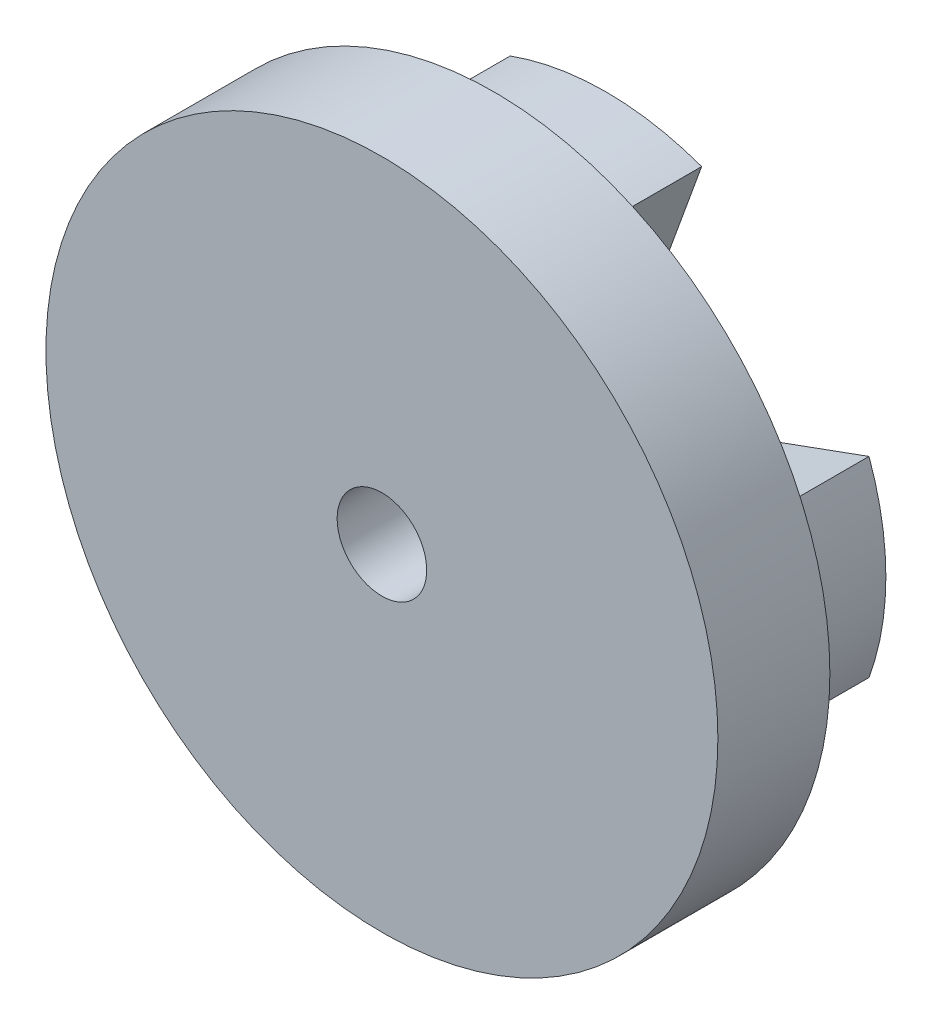
ISO-10303-21;
HEADER;
FILE_DESCRIPTION(('STEP AP214'),'2;1');
FILE_NAME('part.step','',(''),(''),'','','');
FILE_SCHEMA(('AUTOMOTIVE_DESIGN { 1 0 10303 214 1 1 1 1 }'));
ENDSEC;
DATA;
#1=APPLICATION_CONTEXT('core data for automotive mechanical design processes');
#2=APPLICATION_PROTOCOL_DEFINITION('international standard','automotive_design',2000,#1);
#3=PRODUCT_CONTEXT('',#1,'mechanical');
#4=PRODUCT('Part','Part','',(#3));
#5=PRODUCT_RELATED_PRODUCT_CATEGORY('part','',(#4));
#6=PRODUCT_DEFINITION_FORMATION('','',#4);
#7=PRODUCT_DEFINITION_CONTEXT('part definition',#1,'design');
#8=PRODUCT_DEFINITION('design','',#6,#7);
#9=PRODUCT_DEFINITION_SHAPE('','',#8);
#10=(LENGTH_UNIT() NAMED_UNIT(*) SI_UNIT(.MILLI.,.METRE.));
#11=(NAMED_UNIT(*) PLANE_ANGLE_UNIT() SI_UNIT($,.RADIAN.));
#12=(NAMED_UNIT(*) SI_UNIT($,.STERADIAN.) SOLID_ANGLE_UNIT());
#13=UNCERTAINTY_MEASURE_WITH_UNIT(LENGTH_MEASURE(1.E-05),#10,'distance_accuracy_value','');
#14=(GEOMETRIC_REPRESENTATION_CONTEXT(3) GLOBAL_UNCERTAINTY_ASSIGNED_CONTEXT((#13)) GLOBAL_UNIT_ASSIGNED_CONTEXT((#10,
#11,#12)) REPRESENTATION_CONTEXT('',''));
#15=CARTESIAN_POINT('',(0.,0.,0.));
#16=DIRECTION('',(0.,0.,1.));
#17=DIRECTION('',(1.,0.,0.));
#18=AXIS2_PLACEMENT_3D('',#15,#16,#17);
#19=CARTESIAN_POINT('',(0.,0.,0.));
#20=DIRECTION('',(0.,0.,1.));
#21=DIRECTION('',(1.,0.,0.));
#22=AXIS2_PLACEMENT_3D('',#19,#20,#21);
#23=PLANE('',#22);
#24=CARTESIAN_POINT('',(0.,0.,0.));
#25=DIRECTION('',(0.,0.,-1.));
#26=DIRECTION('',(-1.,0.,0.));
#27=AXIS2_PLACEMENT_3D('',#24,#25,#26);
#28=CIRCLE('',#27,2.);
#29=CARTESIAN_POINT('',(-2.,0.,0.));
#30=VERTEX_POINT('',#29);
#31=EDGE_CURVE('E350',#30,#30,#28,.T.);
#32=ORIENTED_EDGE('',*,*,#31,.F.);
#33=EDGE_LOOP('',(#32));
#34=FACE_BOUND('',#33,.T.);
#35=CARTESIAN_POINT('',(0.,0.,0.));
#36=DIRECTION('',(0.,0.,-1.));
#37=DIRECTION('',(-1.,0.,0.));
#38=AXIS2_PLACEMENT_3D('',#35,#36,#37);
#39=CIRCLE('',#38,12.5);
#40=CARTESIAN_POINT('',(4.27525179157087,-11.7461577598239,0.));
#41=VERTEX_POINT('',#40);
#42=CARTESIAN_POINT('',(-4.27525179157087,-11.7461577598239,0.));
#43=VERTEX_POINT('',#42);
#44=EDGE_CURVE('E177',#41,#43,#39,.T.);
#45=ORIENTED_EDGE('',*,*,#44,.F.);
#46=DIRECTION('',(0.34202014332567,-0.939692620785908,0.));
#47=VECTOR('',#46,1.);
#48=CARTESIAN_POINT('',(2.56515107494252,-7.04769465589431,0.));
#49=LINE('',#48,#47);
#50=CARTESIAN_POINT('',(2.56515107494253,-7.04769465589431,0.));
#51=VERTEX_POINT('',#50);
#52=EDGE_CURVE('E193',#51,#41,#49,.T.);
#53=ORIENTED_EDGE('',*,*,#52,.F.);
#54=CARTESIAN_POINT('',(0.,0.,0.));
#55=DIRECTION('',(0.,0.,1.));
#56=DIRECTION('',(-1.,0.,0.));
#57=AXIS2_PLACEMENT_3D('',#54,#55,#56);
#58=CIRCLE('',#57,7.5);
#59=CARTESIAN_POINT('',(-2.56515107494252,-7.04769465589431,0.));
#60=VERTEX_POINT('',#59);
#61=EDGE_CURVE('E206',#60,#51,#58,.T.);
#62=ORIENTED_EDGE('',*,*,#61,.F.);
#63=DIRECTION('',(0.34202014332567,0.939692620785908,0.));
#64=VECTOR('',#63,1.);
#65=CARTESIAN_POINT('',(-2.56515107494252,-7.04769465589431,0.));
#66=LINE('',#65,#64);
#67=EDGE_CURVE('E182',#43,#60,#66,.T.);
#68=ORIENTED_EDGE('',*,*,#67,.F.);
#69=EDGE_LOOP('',(#45,#53,#62,#68));
#70=FACE_BOUND('',#69,.T.);
#71=CARTESIAN_POINT('',(0.,0.,0.));
#72=DIRECTION('',(0.,0.,-1.));
#73=DIRECTION('',(-1.,0.,0.));
#74=AXIS2_PLACEMENT_3D('',#71,#72,#73);
#75=CIRCLE('',#74,12.5);
#76=CARTESIAN_POINT('',(-4.27525179157087,11.7461577598239,0.));
#77=VERTEX_POINT('',#76);
#78=CARTESIAN_POINT('',(4.27525179157087,11.7461577598239,0.));
#79=VERTEX_POINT('',#78);
#80=EDGE_CURVE('E273',#77,#79,#75,.T.);
#81=ORIENTED_EDGE('',*,*,#80,.F.);
#82=DIRECTION('',(-0.34202014332567,0.939692620785908,0.));
#83=VECTOR('',#82,1.);
#84=CARTESIAN_POINT('',(-2.56515107494252,7.04769465589431,0.));
#85=LINE('',#84,#83);
#86=CARTESIAN_POINT('',(-2.56515107494252,7.04769465589431,0.));
#87=VERTEX_POINT('',#86);
#88=EDGE_CURVE('E279',#87,#77,#85,.T.);
#89=ORIENTED_EDGE('',*,*,#88,.F.);
#90=CARTESIAN_POINT('',(0.,0.,0.));
#91=DIRECTION('',(0.,0.,1.));
#92=DIRECTION('',(-1.,0.,0.));
#93=AXIS2_PLACEMENT_3D('',#90,#91,#92);
#94=CIRCLE('',#93,7.5);
#95=CARTESIAN_POINT('',(2.56515107494252,7.04769465589431,0.));
#96=VERTEX_POINT('',#95);
#97=EDGE_CURVE('E296',#96,#87,#94,.T.);
#98=ORIENTED_EDGE('',*,*,#97,.F.);
#99=DIRECTION('',(-0.34202014332567,-0.939692620785908,0.));
#100=VECTOR('',#99,1.);
#101=CARTESIAN_POINT('',(2.56515107494252,7.04769465589431,0.));
#102=LINE('',#101,#100);
#103=EDGE_CURVE('E292',#79,#96,#102,.T.);
#104=ORIENTED_EDGE('',*,*,#103,.F.);
#105=EDGE_LOOP('',(#81,#89,#98,#104));
#106=FACE_BOUND('',#105,.T.);
#107=CARTESIAN_POINT('',(0.,0.,0.));
#108=DIRECTION('',(0.,0.,1.));
#109=DIRECTION('',(1.,0.,0.));
#110=AXIS2_PLACEMENT_3D('',#107,#108,#109);
#111=CIRCLE('',#110,15.);
#112=CARTESIAN_POINT('',(15.,0.,0.));
#113=VERTEX_POINT('',#112);
#114=EDGE_CURVE('E43',#113,#113,#111,.T.);
#115=ORIENTED_EDGE('',*,*,#114,.F.);
#116=EDGE_LOOP('',(#115));
#117=FACE_BOUND('',#116,.T.);
#118=CARTESIAN_POINT('',(0.,0.,0.));
#119=DIRECTION('',(0.,0.,-1.));
#120=DIRECTION('',(-1.,0.,0.));
#121=AXIS2_PLACEMENT_3D('',#118,#119,#120);
#122=CIRCLE('',#121,12.5);
#123=CARTESIAN_POINT('',(-11.7461577598239,-4.27525179157087,0.));
#124=VERTEX_POINT('',#123);
#125=CARTESIAN_POINT('',(-11.7461577598239,4.27525179157087,0.));
#126=VERTEX_POINT('',#125);
#127=EDGE_CURVE('E228',#124,#126,#122,.T.);
#128=ORIENTED_EDGE('',*,*,#127,.F.);
#129=DIRECTION('',(-0.939692620785908,-0.342020143325669,0.));
#130=VECTOR('',#129,1.);
#131=CARTESIAN_POINT('',(-7.04769465589431,-2.56515107494252,0.));
#132=LINE('',#131,#130);
#133=CARTESIAN_POINT('',(-7.04769465589431,-2.56515107494252,0.));
#134=VERTEX_POINT('',#133);
#135=EDGE_CURVE('E234',#134,#124,#132,.T.);
#136=ORIENTED_EDGE('',*,*,#135,.F.);
#137=CARTESIAN_POINT('',(0.,0.,0.));
#138=DIRECTION('',(0.,0.,1.));
#139=DIRECTION('',(-1.,0.,0.));
#140=AXIS2_PLACEMENT_3D('',#137,#138,#139);
#141=CIRCLE('',#140,7.5);
#142=CARTESIAN_POINT('',(-7.04769465589431,2.56515107494252,0.));
#143=VERTEX_POINT('',#142);
#144=EDGE_CURVE('E251',#143,#134,#141,.T.);
#145=ORIENTED_EDGE('',*,*,#144,.F.);
#146=DIRECTION('',(0.939692620785908,-0.34202014332567,0.));
#147=VECTOR('',#146,1.);
#148=CARTESIAN_POINT('',(-7.04769465589431,2.56515107494252,0.));
#149=LINE('',#148,#147);
#150=EDGE_CURVE('E247',#126,#143,#149,.T.);
#151=ORIENTED_EDGE('',*,*,#150,.F.);
#152=EDGE_LOOP('',(#128,#136,#145,#151));
#153=FACE_BOUND('',#152,.T.);
#154=CARTESIAN_POINT('',(0.,0.,0.));
#155=DIRECTION('',(0.,0.,-1.));
#156=DIRECTION('',(-1.,0.,0.));
#157=AXIS2_PLACEMENT_3D('',#154,#155,#156);
#158=CIRCLE('',#157,12.5);
#159=CARTESIAN_POINT('',(11.7461577598239,4.27525179157087,0.));
#160=VERTEX_POINT('',#159);
#161=CARTESIAN_POINT('',(11.7461577598239,-4.27525179157087,0.));
#162=VERTEX_POINT('',#161);
#163=EDGE_CURVE('E175',#160,#162,#158,.T.);
#164=ORIENTED_EDGE('',*,*,#163,.F.);
#165=DIRECTION('',(0.939692620785908,0.342020143325669,0.));
#166=VECTOR('',#165,1.);
#167=CARTESIAN_POINT('',(7.04769465589431,2.56515107494252,0.));
#168=LINE('',#167,#166);
#169=CARTESIAN_POINT('',(7.04769465589431,2.56515107494252,0.));
#170=VERTEX_POINT('',#169);
#171=EDGE_CURVE('E172',#170,#160,#168,.T.);
#172=ORIENTED_EDGE('',*,*,#171,.F.);
#173=CARTESIAN_POINT('',(0.,0.,0.));
#174=DIRECTION('',(0.,0.,1.));
#175=DIRECTION('',(-1.,0.,0.));
#176=AXIS2_PLACEMENT_3D('',#173,#174,#175);
#177=CIRCLE('',#176,7.5);
#178=CARTESIAN_POINT('',(7.04769465589431,-2.56515107494252,0.));
#179=VERTEX_POINT('',#178);
#180=EDGE_CURVE('E60',#179,#170,#177,.T.);
#181=ORIENTED_EDGE('',*,*,#180,.F.);
#182=DIRECTION('',(-0.939692620785908,0.34202014332567,0.));
#183=VECTOR('',#182,1.);
#184=CARTESIAN_POINT('',(7.04769465589431,-2.56515107494252,0.));
#185=LINE('',#184,#183);
#186=EDGE_CURVE('E55',#162,#179,#185,.T.);
#187=ORIENTED_EDGE('',*,*,#186,.F.);
#188=EDGE_LOOP('',(#164,#172,#181,#187));
#189=FACE_BOUND('',#188,.T.);
#190=ADVANCED_FACE('F39',(#34,#70,#106,#117,#153,#189),#23,.F.);
#191=CARTESIAN_POINT('',(0.,0.,5.));
#192=DIRECTION('',(0.,0.,-1.));
#193=DIRECTION('',(-1.,0.,0.));
#194=AXIS2_PLACEMENT_3D('',#191,#192,#193);
#195=CYLINDRICAL_SURFACE('',#194,15.);
#196=CARTESIAN_POINT('',(0.,0.,5.));
#197=DIRECTION('',(0.,0.,1.));
#198=DIRECTION('',(1.,0.,0.));
#199=AXIS2_PLACEMENT_3D('',#196,#197,#198);
#200=CIRCLE('',#199,15.);
#201=CARTESIAN_POINT('',(15.,0.,5.));
#202=VERTEX_POINT('',#201);
#203=EDGE_CURVE('E11',#202,#202,#200,.T.);
#204=ORIENTED_EDGE('',*,*,#203,.F.);
#205=EDGE_LOOP('',(#204));
#206=FACE_BOUND('',#205,.T.);
#207=ORIENTED_EDGE('',*,*,#114,.T.);
#208=EDGE_LOOP('',(#207));
#209=FACE_BOUND('',#208,.T.);
#210=ADVANCED_FACE('F41',(#206,#209),#195,.T.);
#211=CARTESIAN_POINT('',(0.,0.,5.));
#212=DIRECTION('',(0.,0.,1.));
#213=DIRECTION('',(1.,0.,0.));
#214=AXIS2_PLACEMENT_3D('',#211,#212,#213);
#215=PLANE('',#214);
#216=CARTESIAN_POINT('',(0.,0.,5.));
#217=DIRECTION('',(0.,0.,-1.));
#218=DIRECTION('',(-1.,0.,0.));
#219=AXIS2_PLACEMENT_3D('',#216,#217,#218);
#220=CIRCLE('',#219,2.);
#221=CARTESIAN_POINT('',(-2.,0.,5.));
#222=VERTEX_POINT('',#221);
#223=EDGE_CURVE('E329',#222,#222,#220,.T.);
#224=ORIENTED_EDGE('',*,*,#223,.T.);
#225=EDGE_LOOP('',(#224));
#226=FACE_BOUND('',#225,.T.);
#227=ORIENTED_EDGE('',*,*,#203,.T.);
#228=EDGE_LOOP('',(#227));
#229=FACE_BOUND('',#228,.T.);
#230=ADVANCED_FACE('F358',(#226,#229),#215,.T.);
#231=CARTESIAN_POINT('',(0.,0.,-5.));
#232=DIRECTION('',(0.,0.,1.));
#233=DIRECTION('',(1.,0.,0.));
#234=AXIS2_PLACEMENT_3D('',#231,#232,#233);
#235=CYLINDRICAL_SURFACE('',#234,12.5);
#236=ORIENTED_EDGE('',*,*,#80,.T.);
#237=DIRECTION('',(0.,0.,1.));
#238=VECTOR('',#237,1.);
#239=CARTESIAN_POINT('',(4.27525179157087,11.7461577598239,-5.));
#240=LINE('',#239,#238);
#241=CARTESIAN_POINT('',(4.27525179157087,11.7461577598239,-5.));
#242=VERTEX_POINT('',#241);
#243=EDGE_CURVE('E314',#242,#79,#240,.T.);
#244=ORIENTED_EDGE('',*,*,#243,.F.);
#245=CARTESIAN_POINT('',(0.,0.,-5.));
#246=DIRECTION('',(0.,0.,-1.));
#247=DIRECTION('',(-1.,0.,0.));
#248=AXIS2_PLACEMENT_3D('',#245,#246,#247);
#249=CIRCLE('',#248,12.5);
#250=CARTESIAN_POINT('',(-4.27525179157087,11.7461577598239,-5.));
#251=VERTEX_POINT('',#250);
#252=EDGE_CURVE('E274',#251,#242,#249,.T.);
#253=ORIENTED_EDGE('',*,*,#252,.F.);
#254=DIRECTION('',(0.,0.,1.));
#255=VECTOR('',#254,1.);
#256=CARTESIAN_POINT('',(-4.27525179157087,11.7461577598239,-5.));
#257=LINE('',#256,#255);
#258=EDGE_CURVE('E288',#251,#77,#257,.T.);
#259=ORIENTED_EDGE('',*,*,#258,.T.);
#260=EDGE_LOOP('',(#236,#244,#253,#259));
#261=FACE_BOUND('',#260,.T.);
#262=ADVANCED_FACE('F375',(#261),#235,.T.);
#263=CARTESIAN_POINT('',(2.56515107494252,7.04769465589431,-5.));
#264=DIRECTION('',(-0.939692620785908,0.34202014332567,0.));
#265=DIRECTION('',(-0.34202014332567,-0.939692620785908,0.));
#266=AXIS2_PLACEMENT_3D('',#263,#264,#265);
#267=PLANE('',#266);
#268=ORIENTED_EDGE('',*,*,#103,.T.);
#269=DIRECTION('',(0.,0.,1.));
#270=VECTOR('',#269,1.);
#271=CARTESIAN_POINT('',(2.56515107494252,7.04769465589431,-5.));
#272=LINE('',#271,#270);
#273=CARTESIAN_POINT('',(2.56515107494252,7.04769465589431,-5.));
#274=VERTEX_POINT('',#273);
#275=EDGE_CURVE('E310',#274,#96,#272,.T.);
#276=ORIENTED_EDGE('',*,*,#275,.F.);
#277=DIRECTION('',(-0.34202014332567,-0.939692620785908,0.));
#278=VECTOR('',#277,1.);
#279=CARTESIAN_POINT('',(2.56515107494252,7.04769465589431,-5.));
#280=LINE('',#279,#278);
#281=EDGE_CURVE('E278',#242,#274,#280,.T.);
#282=ORIENTED_EDGE('',*,*,#281,.F.);
#283=ORIENTED_EDGE('',*,*,#243,.T.);
#284=EDGE_LOOP('',(#268,#276,#282,#283));
#285=FACE_BOUND('',#284,.T.);
#286=ADVANCED_FACE('F382',(#285),#267,.F.);
#287=CARTESIAN_POINT('',(0.,0.,-5.));
#288=DIRECTION('',(0.,0.,1.));
#289=DIRECTION('',(1.,0.,0.));
#290=AXIS2_PLACEMENT_3D('',#287,#288,#289);
#291=CYLINDRICAL_SURFACE('',#290,7.5);
#292=ORIENTED_EDGE('',*,*,#97,.T.);
#293=DIRECTION('',(0.,0.,1.));
#294=VECTOR('',#293,1.);
#295=CARTESIAN_POINT('',(-2.56515107494252,7.04769465589431,-5.));
#296=LINE('',#295,#294);
#297=CARTESIAN_POINT('',(-2.56515107494252,7.04769465589431,-5.));
#298=VERTEX_POINT('',#297);
#299=EDGE_CURVE('E306',#298,#87,#296,.T.);
#300=ORIENTED_EDGE('',*,*,#299,.F.);
#301=CARTESIAN_POINT('',(0.,0.,-5.));
#302=DIRECTION('',(0.,0.,1.));
#303=DIRECTION('',(-1.,0.,0.));
#304=AXIS2_PLACEMENT_3D('',#301,#302,#303);
#305=CIRCLE('',#304,7.5);
#306=EDGE_CURVE('E282',#274,#298,#305,.T.);
#307=ORIENTED_EDGE('',*,*,#306,.F.);
#308=ORIENTED_EDGE('',*,*,#275,.T.);
#309=EDGE_LOOP('',(#292,#300,#307,#308));
#310=FACE_BOUND('',#309,.T.);
#311=ADVANCED_FACE('F381',(#310),#291,.F.);
#312=CARTESIAN_POINT('',(-2.56515107494252,7.04769465589431,-5.));
#313=DIRECTION('',(0.939692620785908,0.34202014332567,0.));
#314=DIRECTION('',(-0.34202014332567,0.939692620785908,0.));
#315=AXIS2_PLACEMENT_3D('',#312,#313,#314);
#316=PLANE('',#315);
#317=ORIENTED_EDGE('',*,*,#88,.T.);
#318=ORIENTED_EDGE('',*,*,#258,.F.);
#319=DIRECTION('',(-0.34202014332567,0.939692620785908,0.));
#320=VECTOR('',#319,1.);
#321=CARTESIAN_POINT('',(-2.56515107494252,7.04769465589431,-5.));
#322=LINE('',#321,#320);
#323=EDGE_CURVE('E285',#298,#251,#322,.T.);
#324=ORIENTED_EDGE('',*,*,#323,.F.);
#325=ORIENTED_EDGE('',*,*,#299,.T.);
#326=EDGE_LOOP('',(#317,#318,#324,#325));
#327=FACE_BOUND('',#326,.T.);
#328=ADVANCED_FACE('F371',(#327),#316,.F.);
#329=CARTESIAN_POINT('',(0.,0.,-5.));
#330=DIRECTION('',(0.,0.,-1.));
#331=DIRECTION('',(-1.,0.,0.));
#332=AXIS2_PLACEMENT_3D('',#329,#330,#331);
#333=PLANE('',#332);
#334=ORIENTED_EDGE('',*,*,#252,.T.);
#335=ORIENTED_EDGE('',*,*,#281,.T.);
#336=ORIENTED_EDGE('',*,*,#306,.T.);
#337=ORIENTED_EDGE('',*,*,#323,.T.);
#338=EDGE_LOOP('',(#334,#335,#336,#337));
#339=FACE_BOUND('',#338,.T.);
#340=ADVANCED_FACE('F377',(#339),#333,.T.);
#341=CARTESIAN_POINT('',(0.,0.,-5.));
#342=DIRECTION('',(0.,0.,1.));
#343=DIRECTION('',(1.,0.,0.));
#344=AXIS2_PLACEMENT_3D('',#341,#342,#343);
#345=CYLINDRICAL_SURFACE('',#344,12.5);
#346=ORIENTED_EDGE('',*,*,#127,.T.);
#347=DIRECTION('',(0.,0.,1.));
#348=VECTOR('',#347,1.);
#349=CARTESIAN_POINT('',(-11.7461577598239,4.27525179157087,-5.));
#350=LINE('',#349,#348);
#351=CARTESIAN_POINT('',(-11.7461577598239,4.27525179157087,-5.));
#352=VERTEX_POINT('',#351);
#353=EDGE_CURVE('E269',#352,#126,#350,.T.);
#354=ORIENTED_EDGE('',*,*,#353,.F.);
#355=CARTESIAN_POINT('',(0.,0.,-5.));
#356=DIRECTION('',(0.,0.,-1.));
#357=DIRECTION('',(-1.,0.,0.));
#358=AXIS2_PLACEMENT_3D('',#355,#356,#357);
#359=CIRCLE('',#358,12.5);
#360=CARTESIAN_POINT('',(-11.7461577598239,-4.27525179157087,-5.));
#361=VERTEX_POINT('',#360);
#362=EDGE_CURVE('E229',#361,#352,#359,.T.);
#363=ORIENTED_EDGE('',*,*,#362,.F.);
#364=DIRECTION('',(0.,0.,1.));
#365=VECTOR('',#364,1.);
#366=CARTESIAN_POINT('',(-11.7461577598239,-4.27525179157087,-5.));
#367=LINE('',#366,#365);
#368=EDGE_CURVE('E243',#361,#124,#367,.T.);
#369=ORIENTED_EDGE('',*,*,#368,.T.);
#370=EDGE_LOOP('',(#346,#354,#363,#369));
#371=FACE_BOUND('',#370,.T.);
#372=ADVANCED_FACE('F522',(#371),#345,.T.);
#373=CARTESIAN_POINT('',(-7.04769465589431,2.56515107494252,-5.));
#374=DIRECTION('',(-0.34202014332567,-0.939692620785908,0.));
#375=DIRECTION('',(0.939692620785908,-0.34202014332567,0.));
#376=AXIS2_PLACEMENT_3D('',#373,#374,#375);
#377=PLANE('',#376);
#378=ORIENTED_EDGE('',*,*,#150,.T.);
#379=DIRECTION('',(0.,0.,1.));
#380=VECTOR('',#379,1.);
#381=CARTESIAN_POINT('',(-7.04769465589431,2.56515107494252,-5.));
#382=LINE('',#381,#380);
#383=CARTESIAN_POINT('',(-7.04769465589431,2.56515107494252,-5.));
#384=VERTEX_POINT('',#383);
#385=EDGE_CURVE('E265',#384,#143,#382,.T.);
#386=ORIENTED_EDGE('',*,*,#385,.F.);
#387=DIRECTION('',(0.939692620785908,-0.34202014332567,0.));
#388=VECTOR('',#387,1.);
#389=CARTESIAN_POINT('',(-7.04769465589431,2.56515107494252,-5.));
#390=LINE('',#389,#388);
#391=EDGE_CURVE('E233',#352,#384,#390,.T.);
#392=ORIENTED_EDGE('',*,*,#391,.F.);
#393=ORIENTED_EDGE('',*,*,#353,.T.);
#394=EDGE_LOOP('',(#378,#386,#392,#393));
#395=FACE_BOUND('',#394,.T.);
#396=ADVANCED_FACE('F514',(#395),#377,.F.);
#397=CARTESIAN_POINT('',(0.,0.,-5.));
#398=DIRECTION('',(0.,0.,1.));
#399=DIRECTION('',(1.,0.,0.));
#400=AXIS2_PLACEMENT_3D('',#397,#398,#399);
#401=CYLINDRICAL_SURFACE('',#400,7.5);
#402=ORIENTED_EDGE('',*,*,#144,.T.);
#403=DIRECTION('',(0.,0.,1.));
#404=VECTOR('',#403,1.);
#405=CARTESIAN_POINT('',(-7.04769465589431,-2.56515107494252,-5.));
#406=LINE('',#405,#404);
#407=CARTESIAN_POINT('',(-7.04769465589431,-2.56515107494252,-5.));
#408=VERTEX_POINT('',#407);
#409=EDGE_CURVE('E261',#408,#134,#406,.T.);
#410=ORIENTED_EDGE('',*,*,#409,.F.);
#411=CARTESIAN_POINT('',(0.,0.,-5.));
#412=DIRECTION('',(0.,0.,1.));
#413=DIRECTION('',(-1.,0.,0.));
#414=AXIS2_PLACEMENT_3D('',#411,#412,#413);
#415=CIRCLE('',#414,7.5);
#416=EDGE_CURVE('E237',#384,#408,#415,.T.);
#417=ORIENTED_EDGE('',*,*,#416,.F.);
#418=ORIENTED_EDGE('',*,*,#385,.T.);
#419=EDGE_LOOP('',(#402,#410,#417,#418));
#420=FACE_BOUND('',#419,.T.);
#421=ADVANCED_FACE('F506',(#420),#401,.F.);
#422=CARTESIAN_POINT('',(-7.04769465589431,-2.56515107494252,-5.));
#423=DIRECTION('',(-0.342020143325669,0.939692620785908,0.));
#424=DIRECTION('',(-0.939692620785908,-0.342020143325669,0.));
#425=AXIS2_PLACEMENT_3D('',#422,#423,#424);
#426=PLANE('',#425);
#427=ORIENTED_EDGE('',*,*,#135,.T.);
#428=ORIENTED_EDGE('',*,*,#368,.F.);
#429=DIRECTION('',(-0.939692620785908,-0.342020143325669,0.));
#430=VECTOR('',#429,1.);
#431=CARTESIAN_POINT('',(-7.04769465589431,-2.56515107494252,-5.));
#432=LINE('',#431,#430);
#433=EDGE_CURVE('E240',#408,#361,#432,.T.);
#434=ORIENTED_EDGE('',*,*,#433,.F.);
#435=ORIENTED_EDGE('',*,*,#409,.T.);
#436=EDGE_LOOP('',(#427,#428,#434,#435));
#437=FACE_BOUND('',#436,.T.);
#438=ADVANCED_FACE('F498',(#437),#426,.F.);
#439=CARTESIAN_POINT('',(0.,0.,-5.));
#440=DIRECTION('',(0.,0.,-1.));
#441=DIRECTION('',(-1.,0.,0.));
#442=AXIS2_PLACEMENT_3D('',#439,#440,#441);
#443=PLANE('',#442);
#444=ORIENTED_EDGE('',*,*,#362,.T.);
#445=ORIENTED_EDGE('',*,*,#391,.T.);
#446=ORIENTED_EDGE('',*,*,#416,.T.);
#447=ORIENTED_EDGE('',*,*,#433,.T.);
#448=EDGE_LOOP('',(#444,#445,#446,#447));
#449=FACE_BOUND('',#448,.T.);
#450=ADVANCED_FACE('F490',(#449),#443,.T.);
#451=CARTESIAN_POINT('',(0.,0.,-5.));
#452=DIRECTION('',(0.,0.,1.));
#453=DIRECTION('',(1.,0.,0.));
#454=AXIS2_PLACEMENT_3D('',#451,#452,#453);
#455=CYLINDRICAL_SURFACE('',#454,12.5);
#456=ORIENTED_EDGE('',*,*,#44,.T.);
#457=DIRECTION('',(0.,0.,1.));
#458=VECTOR('',#457,1.);
#459=CARTESIAN_POINT('',(-4.27525179157087,-11.7461577598239,-5.));
#460=LINE('',#459,#458);
#461=CARTESIAN_POINT('',(-4.27525179157087,-11.7461577598239,-5.));
#462=VERTEX_POINT('',#461);
#463=EDGE_CURVE('E224',#462,#43,#460,.T.);
#464=ORIENTED_EDGE('',*,*,#463,.F.);
#465=CARTESIAN_POINT('',(0.,0.,-5.));
#466=DIRECTION('',(0.,0.,-1.));
#467=DIRECTION('',(-1.,0.,0.));
#468=AXIS2_PLACEMENT_3D('',#465,#466,#467);
#469=CIRCLE('',#468,12.5);
#470=CARTESIAN_POINT('',(4.27525179157087,-11.7461577598239,-5.));
#471=VERTEX_POINT('',#470);
#472=EDGE_CURVE('E188',#471,#462,#469,.T.);
#473=ORIENTED_EDGE('',*,*,#472,.F.);
#474=DIRECTION('',(0.,0.,1.));
#475=VECTOR('',#474,1.);
#476=CARTESIAN_POINT('',(4.27525179157087,-11.7461577598239,-5.));
#477=LINE('',#476,#475);
#478=EDGE_CURVE('E201',#471,#41,#477,.T.);
#479=ORIENTED_EDGE('',*,*,#478,.T.);
#480=EDGE_LOOP('',(#456,#464,#473,#479));
#481=FACE_BOUND('',#480,.T.);
#482=ADVANCED_FACE('F482',(#481),#455,.T.);
#483=CARTESIAN_POINT('',(-2.56515107494252,-7.04769465589431,-5.));
#484=DIRECTION('',(0.939692620785908,-0.34202014332567,0.));
#485=DIRECTION('',(0.34202014332567,0.939692620785908,0.));
#486=AXIS2_PLACEMENT_3D('',#483,#484,#485);
#487=PLANE('',#486);
#488=ORIENTED_EDGE('',*,*,#67,.T.);
#489=DIRECTION('',(0.,0.,1.));
#490=VECTOR('',#489,1.);
#491=CARTESIAN_POINT('',(-2.56515107494252,-7.04769465589431,-5.));
#492=LINE('',#491,#490);
#493=CARTESIAN_POINT('',(-2.56515107494252,-7.04769465589431,-5.));
#494=VERTEX_POINT('',#493);
#495=EDGE_CURVE('E220',#494,#60,#492,.T.);
#496=ORIENTED_EDGE('',*,*,#495,.F.);
#497=DIRECTION('',(0.34202014332567,0.939692620785908,0.));
#498=VECTOR('',#497,1.);
#499=CARTESIAN_POINT('',(-2.56515107494252,-7.04769465589431,-5.));
#500=LINE('',#499,#498);
#501=EDGE_CURVE('E192',#462,#494,#500,.T.);
#502=ORIENTED_EDGE('',*,*,#501,.F.);
#503=ORIENTED_EDGE('',*,*,#463,.T.);
#504=EDGE_LOOP('',(#488,#496,#502,#503));
#505=FACE_BOUND('',#504,.T.);
#506=ADVANCED_FACE('F474',(#505),#487,.F.);
#507=CARTESIAN_POINT('',(0.,0.,-5.));
#508=DIRECTION('',(0.,0.,1.));
#509=DIRECTION('',(1.,0.,0.));
#510=AXIS2_PLACEMENT_3D('',#507,#508,#509);
#511=CYLINDRICAL_SURFACE('',#510,7.5);
#512=ORIENTED_EDGE('',*,*,#61,.T.);
#513=DIRECTION('',(0.,0.,1.));
#514=VECTOR('',#513,1.);
#515=CARTESIAN_POINT('',(2.56515107494251,-7.04769465589431,-5.));
#516=LINE('',#515,#514);
#517=CARTESIAN_POINT('',(2.56515107494251,-7.04769465589431,-5.));
#518=VERTEX_POINT('',#517);
#519=EDGE_CURVE('E216',#518,#51,#516,.T.);
#520=ORIENTED_EDGE('',*,*,#519,.F.);
#521=CARTESIAN_POINT('',(0.,0.,-5.));
#522=DIRECTION('',(0.,0.,1.));
#523=DIRECTION('',(-1.,0.,0.));
#524=AXIS2_PLACEMENT_3D('',#521,#522,#523);
#525=CIRCLE('',#524,7.5);
#526=EDGE_CURVE('E196',#494,#518,#525,.T.);
#527=ORIENTED_EDGE('',*,*,#526,.F.);
#528=ORIENTED_EDGE('',*,*,#495,.T.);
#529=EDGE_LOOP('',(#512,#520,#527,#528));
#530=FACE_BOUND('',#529,.T.);
#531=ADVANCED_FACE('F466',(#530),#511,.F.);
#532=CARTESIAN_POINT('',(2.56515107494252,-7.04769465589431,-5.));
#533=DIRECTION('',(-0.939692620785908,-0.34202014332567,0.));
#534=DIRECTION('',(0.34202014332567,-0.939692620785908,0.));
#535=AXIS2_PLACEMENT_3D('',#532,#533,#534);
#536=PLANE('',#535);
#537=ORIENTED_EDGE('',*,*,#52,.T.);
#538=ORIENTED_EDGE('',*,*,#478,.F.);
#539=DIRECTION('',(0.34202014332567,-0.939692620785908,0.));
#540=VECTOR('',#539,1.);
#541=CARTESIAN_POINT('',(2.56515107494252,-7.04769465589431,-5.));
#542=LINE('',#541,#540);
#543=EDGE_CURVE('E199',#518,#471,#542,.T.);
#544=ORIENTED_EDGE('',*,*,#543,.F.);
#545=ORIENTED_EDGE('',*,*,#519,.T.);
#546=EDGE_LOOP('',(#537,#538,#544,#545));
#547=FACE_BOUND('',#546,.T.);
#548=ADVANCED_FACE('F458',(#547),#536,.F.);
#549=CARTESIAN_POINT('',(0.,0.,-5.));
#550=DIRECTION('',(0.,0.,-1.));
#551=DIRECTION('',(-1.,0.,0.));
#552=AXIS2_PLACEMENT_3D('',#549,#550,#551);
#553=PLANE('',#552);
#554=ORIENTED_EDGE('',*,*,#472,.T.);
#555=ORIENTED_EDGE('',*,*,#501,.T.);
#556=ORIENTED_EDGE('',*,*,#526,.T.);
#557=ORIENTED_EDGE('',*,*,#543,.T.);
#558=EDGE_LOOP('',(#554,#555,#556,#557));
#559=FACE_BOUND('',#558,.T.);
#560=ADVANCED_FACE('F451',(#559),#553,.T.);
#561=CARTESIAN_POINT('',(0.,0.,-5.));
#562=DIRECTION('',(0.,0.,1.));
#563=DIRECTION('',(1.,0.,0.));
#564=AXIS2_PLACEMENT_3D('',#561,#562,#563);
#565=CYLINDRICAL_SURFACE('',#564,12.5);
#566=ORIENTED_EDGE('',*,*,#163,.T.);
#567=DIRECTION('',(0.,0.,1.));
#568=VECTOR('',#567,1.);
#569=CARTESIAN_POINT('',(11.7461577598239,-4.27525179157087,-5.));
#570=LINE('',#569,#568);
#571=CARTESIAN_POINT('',(11.7461577598239,-4.27525179157087,-5.));
#572=VERTEX_POINT('',#571);
#573=EDGE_CURVE('E154',#572,#162,#570,.T.);
#574=ORIENTED_EDGE('',*,*,#573,.F.);
#575=CARTESIAN_POINT('',(0.,0.,-5.));
#576=DIRECTION('',(0.,0.,-1.));
#577=DIRECTION('',(-1.,0.,0.));
#578=AXIS2_PLACEMENT_3D('',#575,#576,#577);
#579=CIRCLE('',#578,12.5);
#580=CARTESIAN_POINT('',(11.7461577598239,4.27525179157087,-5.));
#581=VERTEX_POINT('',#580);
#582=EDGE_CURVE('E162',#581,#572,#579,.T.);
#583=ORIENTED_EDGE('',*,*,#582,.F.);
#584=DIRECTION('',(0.,0.,1.));
#585=VECTOR('',#584,1.);
#586=CARTESIAN_POINT('',(11.7461577598239,4.27525179157087,-5.));
#587=LINE('',#586,#585);
#588=EDGE_CURVE('E334',#581,#160,#587,.T.);
#589=ORIENTED_EDGE('',*,*,#588,.T.);
#590=EDGE_LOOP('',(#566,#574,#583,#589));
#591=FACE_BOUND('',#590,.T.);
#592=ADVANCED_FACE('F174',(#591),#565,.T.);
#593=CARTESIAN_POINT('',(7.04769465589431,-2.56515107494252,-5.));
#594=DIRECTION('',(0.34202014332567,0.939692620785908,0.));
#595=DIRECTION('',(-0.939692620785908,0.34202014332567,0.));
#596=AXIS2_PLACEMENT_3D('',#593,#594,#595);
#597=PLANE('',#596);
#598=ORIENTED_EDGE('',*,*,#186,.T.);
#599=DIRECTION('',(0.,0.,1.));
#600=VECTOR('',#599,1.);
#601=CARTESIAN_POINT('',(7.04769465589431,-2.56515107494252,-5.));
#602=LINE('',#601,#600);
#603=CARTESIAN_POINT('',(7.04769465589431,-2.56515107494252,-5.));
#604=VERTEX_POINT('',#603);
#605=EDGE_CURVE('E157',#604,#179,#602,.T.);
#606=ORIENTED_EDGE('',*,*,#605,.F.);
#607=DIRECTION('',(-0.939692620785908,0.34202014332567,0.));
#608=VECTOR('',#607,1.);
#609=CARTESIAN_POINT('',(7.04769465589431,-2.56515107494252,-5.));
#610=LINE('',#609,#608);
#611=EDGE_CURVE('E150',#572,#604,#610,.T.);
#612=ORIENTED_EDGE('',*,*,#611,.F.);
#613=ORIENTED_EDGE('',*,*,#573,.T.);
#614=EDGE_LOOP('',(#598,#606,#612,#613));
#615=FACE_BOUND('',#614,.T.);
#616=ADVANCED_FACE('F152',(#615),#597,.F.);
#617=CARTESIAN_POINT('',(0.,0.,-5.));
#618=DIRECTION('',(0.,0.,1.));
#619=DIRECTION('',(1.,0.,0.));
#620=AXIS2_PLACEMENT_3D('',#617,#618,#619);
#621=CYLINDRICAL_SURFACE('',#620,7.5);
#622=ORIENTED_EDGE('',*,*,#180,.T.);
#623=DIRECTION('',(0.,0.,1.));
#624=VECTOR('',#623,1.);
#625=CARTESIAN_POINT('',(7.04769465589431,2.56515107494252,-5.));
#626=LINE('',#625,#624);
#627=CARTESIAN_POINT('',(7.04769465589431,2.56515107494252,-5.));
#628=VERTEX_POINT('',#627);
#629=EDGE_CURVE('E184',#628,#170,#626,.T.);
#630=ORIENTED_EDGE('',*,*,#629,.F.);
#631=CARTESIAN_POINT('',(0.,0.,-5.));
#632=DIRECTION('',(0.,0.,1.));
#633=DIRECTION('',(-1.,0.,0.));
#634=AXIS2_PLACEMENT_3D('',#631,#632,#633);
#635=CIRCLE('',#634,7.5);
#636=EDGE_CURVE('E161',#604,#628,#635,.T.);
#637=ORIENTED_EDGE('',*,*,#636,.F.);
#638=ORIENTED_EDGE('',*,*,#605,.T.);
#639=EDGE_LOOP('',(#622,#630,#637,#638));
#640=FACE_BOUND('',#639,.T.);
#641=ADVANCED_FACE('F431',(#640),#621,.F.);
#642=CARTESIAN_POINT('',(7.04769465589431,2.56515107494252,-5.));
#643=DIRECTION('',(0.342020143325669,-0.939692620785908,0.));
#644=DIRECTION('',(0.939692620785908,0.342020143325669,0.));
#645=AXIS2_PLACEMENT_3D('',#642,#643,#644);
#646=PLANE('',#645);
#647=ORIENTED_EDGE('',*,*,#171,.T.);
#648=ORIENTED_EDGE('',*,*,#588,.F.);
#649=DIRECTION('',(0.939692620785908,0.342020143325669,0.));
#650=VECTOR('',#649,1.);
#651=CARTESIAN_POINT('',(7.04769465589431,2.56515107494252,-5.));
#652=LINE('',#651,#650);
#653=EDGE_CURVE('E167',#628,#581,#652,.T.);
#654=ORIENTED_EDGE('',*,*,#653,.F.);
#655=ORIENTED_EDGE('',*,*,#629,.T.);
#656=EDGE_LOOP('',(#647,#648,#654,#655));
#657=FACE_BOUND('',#656,.T.);
#658=ADVANCED_FACE('F333',(#657),#646,.F.);
#659=CARTESIAN_POINT('',(0.,0.,-5.));
#660=DIRECTION('',(0.,0.,-1.));
#661=DIRECTION('',(-1.,0.,0.));
#662=AXIS2_PLACEMENT_3D('',#659,#660,#661);
#663=PLANE('',#662);
#664=ORIENTED_EDGE('',*,*,#582,.T.);
#665=ORIENTED_EDGE('',*,*,#611,.T.);
#666=ORIENTED_EDGE('',*,*,#636,.T.);
#667=ORIENTED_EDGE('',*,*,#653,.T.);
#668=EDGE_LOOP('',(#664,#665,#666,#667));
#669=FACE_BOUND('',#668,.T.);
#670=ADVANCED_FACE('F165',(#669),#663,.T.);
#671=CARTESIAN_POINT('',(0.,0.,5.));
#672=DIRECTION('',(0.,0.,-1.));
#673=DIRECTION('',(-1.,0.,0.));
#674=AXIS2_PLACEMENT_3D('',#671,#672,#673);
#675=CYLINDRICAL_SURFACE('',#674,2.);
#676=ORIENTED_EDGE('',*,*,#223,.F.);
#677=EDGE_LOOP('',(#676));
#678=FACE_BOUND('',#677,.T.);
#679=ORIENTED_EDGE('',*,*,#31,.T.);
#680=EDGE_LOOP('',(#679));
#681=FACE_BOUND('',#680,.T.);
#682=ADVANCED_FACE('F361',(#678,#681),#675,.F.);
#683=CLOSED_SHELL('',(#190,#210,#230,#262,#286,#311,#328,#340,#372,#396,#421,#438,#450,#482,
#506,#531,#548,#560,#592,#616,#641,#658,#670,#682));
#684=MANIFOLD_SOLID_BREP('B2',#683);
#685=ADVANCED_BREP_SHAPE_REPRESENTATION('',(#18,#684),#14);
#686=SHAPE_DEFINITION_REPRESENTATION(#9,#685);
ENDSEC;
END-ISO-10303-21;
